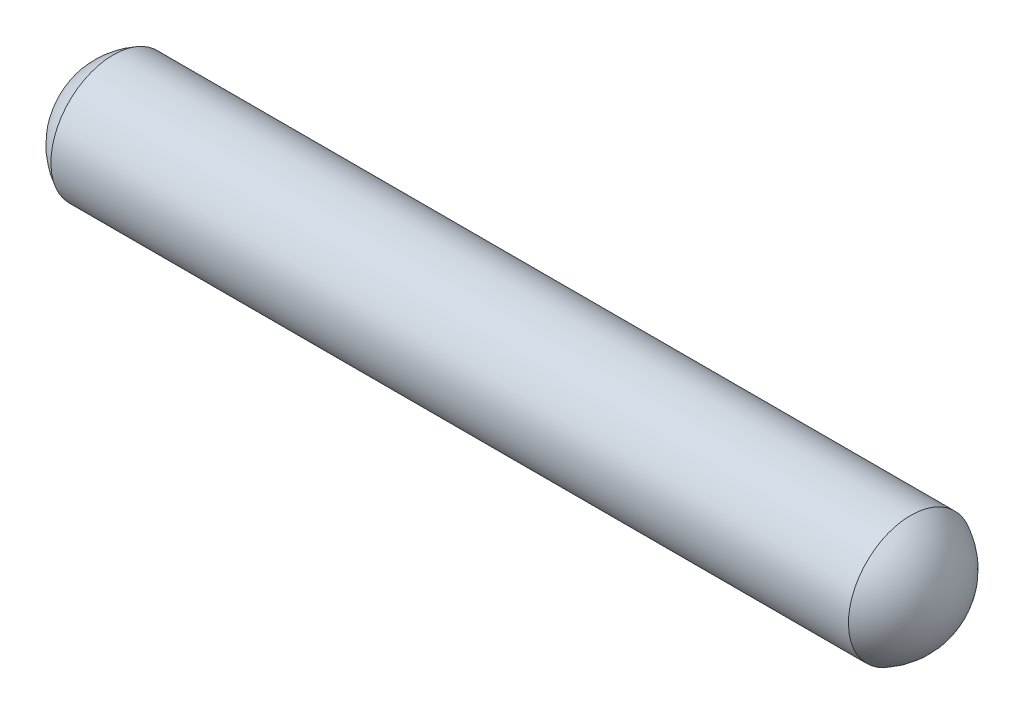
ISO-10303-21;
HEADER;
FILE_DESCRIPTION(('STEP AP214'),'2;1');
FILE_NAME('part.step','',(''),(''),'','','');
FILE_SCHEMA(('AUTOMOTIVE_DESIGN { 1 0 10303 214 1 1 1 1 }'));
ENDSEC;
DATA;
#1=APPLICATION_CONTEXT('core data for automotive mechanical design processes');
#2=APPLICATION_PROTOCOL_DEFINITION('international standard','automotive_design',2000,#1);
#3=PRODUCT_CONTEXT('',#1,'mechanical');
#4=PRODUCT('Part','Part','',(#3));
#5=PRODUCT_RELATED_PRODUCT_CATEGORY('part','',(#4));
#6=PRODUCT_DEFINITION_FORMATION('','',#4);
#7=PRODUCT_DEFINITION_CONTEXT('part definition',#1,'design');
#8=PRODUCT_DEFINITION('design','',#6,#7);
#9=PRODUCT_DEFINITION_SHAPE('','',#8);
#10=(LENGTH_UNIT() NAMED_UNIT(*) SI_UNIT(.MILLI.,.METRE.));
#11=(NAMED_UNIT(*) PLANE_ANGLE_UNIT() SI_UNIT($,.RADIAN.));
#12=(NAMED_UNIT(*) SI_UNIT($,.STERADIAN.) SOLID_ANGLE_UNIT());
#13=UNCERTAINTY_MEASURE_WITH_UNIT(LENGTH_MEASURE(1.E-05),#10,'distance_accuracy_value','');
#14=(GEOMETRIC_REPRESENTATION_CONTEXT(3) GLOBAL_UNCERTAINTY_ASSIGNED_CONTEXT((#13)) GLOBAL_UNIT_ASSIGNED_CONTEXT((#10,
#11,#12)) REPRESENTATION_CONTEXT('',''));
#15=CARTESIAN_POINT('',(0.,0.,0.));
#16=DIRECTION('',(0.,0.,1.));
#17=DIRECTION('',(1.,0.,0.));
#18=AXIS2_PLACEMENT_3D('',#15,#16,#17);
#19=CARTESIAN_POINT('',(-14.75,0.,0.));
#20=DIRECTION('',(1.,0.,0.));
#21=DIRECTION('',(0.,1.,0.));
#22=AXIS2_PLACEMENT_3D('',#19,#20,#21);
#23=SPHERICAL_SURFACE('',#22,2.79508497187475);
#24=CARTESIAN_POINT('',(-16.,0.,0.));
#25=DIRECTION('',(1.,0.,0.));
#26=DIRECTION('',(0.,1.,0.));
#27=AXIS2_PLACEMENT_3D('',#24,#25,#26);
#28=CIRCLE('',#27,2.5);
#29=CARTESIAN_POINT('',(-16.,2.5,0.));
#30=VERTEX_POINT('',#29);
#31=EDGE_CURVE('E10',#30,#30,#28,.T.);
#32=ORIENTED_EDGE('',*,*,#31,.F.);
#33=EDGE_LOOP('',(#32));
#34=FACE_BOUND('',#33,.T.);
#35=ADVANCED_FACE('F37',(#34),#23,.T.);
#36=CARTESIAN_POINT('',(0.,0.,0.));
#37=DIRECTION('',(1.,0.,0.));
#38=DIRECTION('',(0.,1.,0.));
#39=AXIS2_PLACEMENT_3D('',#36,#37,#38);
#40=CYLINDRICAL_SURFACE('',#39,2.5);
#41=ORIENTED_EDGE('',*,*,#31,.T.);
#42=EDGE_LOOP('',(#41));
#43=FACE_BOUND('',#42,.T.);
#44=CARTESIAN_POINT('',(16.,0.,0.));
#45=DIRECTION('',(1.,0.,0.));
#46=DIRECTION('',(0.,1.,0.));
#47=AXIS2_PLACEMENT_3D('',#44,#45,#46);
#48=CIRCLE('',#47,2.5);
#49=CARTESIAN_POINT('',(16.,2.5,0.));
#50=VERTEX_POINT('',#49);
#51=EDGE_CURVE('E44',#50,#50,#48,.T.);
#52=ORIENTED_EDGE('',*,*,#51,.F.);
#53=EDGE_LOOP('',(#52));
#54=FACE_BOUND('',#53,.T.);
#55=ADVANCED_FACE('F53',(#43,#54),#40,.T.);
#56=CARTESIAN_POINT('',(14.75,0.,0.));
#57=DIRECTION('',(-1.,0.,0.));
#58=DIRECTION('',(0.,1.,0.));
#59=AXIS2_PLACEMENT_3D('',#56,#57,#58);
#60=SPHERICAL_SURFACE('',#59,2.79508497187475);
#61=ORIENTED_EDGE('',*,*,#51,.T.);
#62=EDGE_LOOP('',(#61));
#63=FACE_BOUND('',#62,.T.);
#64=ADVANCED_FACE('F51',(#63),#60,.T.);
#65=CLOSED_SHELL('',(#35,#55,#64));
#66=MANIFOLD_SOLID_BREP('B2',#65);
#67=ADVANCED_BREP_SHAPE_REPRESENTATION('',(#18,#66),#14);
#68=SHAPE_DEFINITION_REPRESENTATION(#9,#67);
ENDSEC;
END-ISO-10303-21;
